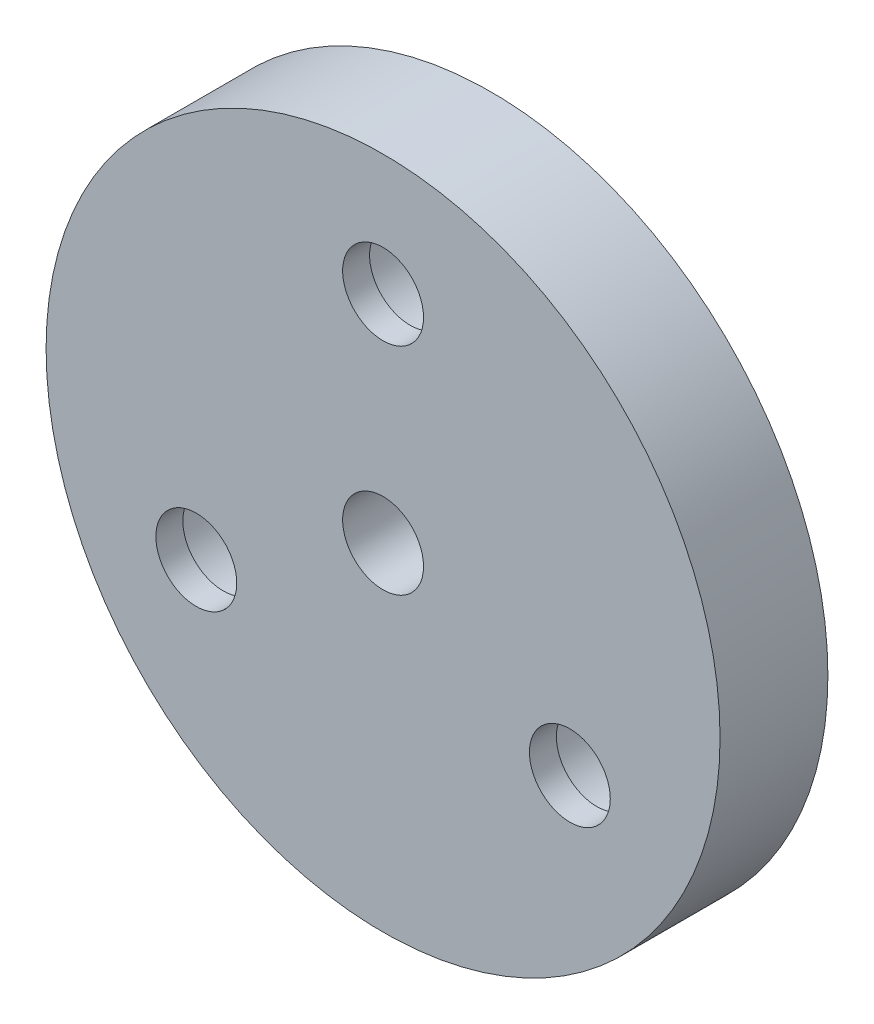
ISO-10303-21;
HEADER;
FILE_DESCRIPTION(('STEP AP214'),'2;1');
FILE_NAME('part.step','',(''),(''),'','','');
FILE_SCHEMA(('AUTOMOTIVE_DESIGN { 1 0 10303 214 1 1 1 1 }'));
ENDSEC;
DATA;
#1=APPLICATION_CONTEXT('core data for automotive mechanical design processes');
#2=APPLICATION_PROTOCOL_DEFINITION('international standard','automotive_design',2000,#1);
#3=PRODUCT_CONTEXT('',#1,'mechanical');
#4=PRODUCT('Part','Part','',(#3));
#5=PRODUCT_RELATED_PRODUCT_CATEGORY('part','',(#4));
#6=PRODUCT_DEFINITION_FORMATION('','',#4);
#7=PRODUCT_DEFINITION_CONTEXT('part definition',#1,'design');
#8=PRODUCT_DEFINITION('design','',#6,#7);
#9=PRODUCT_DEFINITION_SHAPE('','',#8);
#10=(LENGTH_UNIT() NAMED_UNIT(*) SI_UNIT(.MILLI.,.METRE.));
#11=(NAMED_UNIT(*) PLANE_ANGLE_UNIT() SI_UNIT($,.RADIAN.));
#12=(NAMED_UNIT(*) SI_UNIT($,.STERADIAN.) SOLID_ANGLE_UNIT());
#13=UNCERTAINTY_MEASURE_WITH_UNIT(LENGTH_MEASURE(1.E-05),#10,'distance_accuracy_value','');
#14=(GEOMETRIC_REPRESENTATION_CONTEXT(3) GLOBAL_UNCERTAINTY_ASSIGNED_CONTEXT((#13)) GLOBAL_UNIT_ASSIGNED_CONTEXT((#10,
#11,#12)) REPRESENTATION_CONTEXT('',''));
#15=CARTESIAN_POINT('',(0.,0.,0.));
#16=DIRECTION('',(0.,0.,1.));
#17=DIRECTION('',(1.,0.,0.));
#18=AXIS2_PLACEMENT_3D('',#15,#16,#17);
#19=CARTESIAN_POINT('',(-6.92820323027551,-4.,-4.));
#20=DIRECTION('',(0.,0.,1.));
#21=DIRECTION('',(-1.,0.,0.));
#22=AXIS2_PLACEMENT_3D('',#19,#20,#21);
#23=CYLINDRICAL_SURFACE('',#22,1.5);
#24=CARTESIAN_POINT('',(-6.92820323027551,-4.,0.));
#25=DIRECTION('',(0.,0.,1.));
#26=DIRECTION('',(1.,0.,0.));
#27=AXIS2_PLACEMENT_3D('',#24,#25,#26);
#28=CIRCLE('',#27,1.5);
#29=CARTESIAN_POINT('',(-5.42820323027551,-4.,0.));
#30=VERTEX_POINT('',#29);
#31=EDGE_CURVE('E50',#30,#30,#28,.T.);
#32=ORIENTED_EDGE('',*,*,#31,.T.);
#33=EDGE_LOOP('',(#32));
#34=FACE_BOUND('',#33,.T.);
#35=CARTESIAN_POINT('',(-6.92820323027551,-4.,-1.));
#36=DIRECTION('',(0.,0.,1.));
#37=DIRECTION('',(1.,0.,0.));
#38=AXIS2_PLACEMENT_3D('',#35,#36,#37);
#39=CIRCLE('',#38,1.5);
#40=CARTESIAN_POINT('',(-5.42820323027551,-4.,-1.));
#41=VERTEX_POINT('',#40);
#42=EDGE_CURVE('E41',#41,#41,#39,.T.);
#43=ORIENTED_EDGE('',*,*,#42,.F.);
#44=EDGE_LOOP('',(#43));
#45=FACE_BOUND('',#44,.T.);
#46=ADVANCED_FACE('F37',(#34,#45),#23,.F.);
#47=CARTESIAN_POINT('',(6.92820323027551,-4.,-4.));
#48=DIRECTION('',(0.,0.,1.));
#49=DIRECTION('',(-1.,0.,0.));
#50=AXIS2_PLACEMENT_3D('',#47,#48,#49);
#51=CYLINDRICAL_SURFACE('',#50,1.5);
#52=CARTESIAN_POINT('',(6.92820323027551,-4.,0.));
#53=DIRECTION('',(0.,0.,1.));
#54=DIRECTION('',(1.,0.,0.));
#55=AXIS2_PLACEMENT_3D('',#52,#53,#54);
#56=CIRCLE('',#55,1.5);
#57=CARTESIAN_POINT('',(8.42820323027551,-4.,0.));
#58=VERTEX_POINT('',#57);
#59=EDGE_CURVE('E67',#58,#58,#56,.T.);
#60=ORIENTED_EDGE('',*,*,#59,.T.);
#61=EDGE_LOOP('',(#60));
#62=FACE_BOUND('',#61,.T.);
#63=CARTESIAN_POINT('',(6.92820323027551,-4.,-1.));
#64=DIRECTION('',(0.,0.,1.));
#65=DIRECTION('',(1.,0.,0.));
#66=AXIS2_PLACEMENT_3D('',#63,#64,#65);
#67=CIRCLE('',#66,1.5);
#68=CARTESIAN_POINT('',(8.42820323027551,-4.,-1.));
#69=VERTEX_POINT('',#68);
#70=EDGE_CURVE('E57',#69,#69,#67,.T.);
#71=ORIENTED_EDGE('',*,*,#70,.F.);
#72=EDGE_LOOP('',(#71));
#73=FACE_BOUND('',#72,.T.);
#74=ADVANCED_FACE('F112',(#62,#73),#51,.F.);
#75=CARTESIAN_POINT('',(0.,8.,-4.));
#76=DIRECTION('',(0.,0.,1.));
#77=DIRECTION('',(-1.,0.,0.));
#78=AXIS2_PLACEMENT_3D('',#75,#76,#77);
#79=CYLINDRICAL_SURFACE('',#78,1.5);
#80=CARTESIAN_POINT('',(0.,8.,0.));
#81=DIRECTION('',(0.,0.,1.));
#82=DIRECTION('',(1.,0.,0.));
#83=AXIS2_PLACEMENT_3D('',#80,#81,#82);
#84=CIRCLE('',#83,1.5);
#85=CARTESIAN_POINT('',(1.5,8.,0.));
#86=VERTEX_POINT('',#85);
#87=EDGE_CURVE('E63',#86,#86,#84,.T.);
#88=ORIENTED_EDGE('',*,*,#87,.T.);
#89=EDGE_LOOP('',(#88));
#90=FACE_BOUND('',#89,.T.);
#91=CARTESIAN_POINT('',(0.,8.,-1.));
#92=DIRECTION('',(0.,0.,1.));
#93=DIRECTION('',(1.,0.,0.));
#94=AXIS2_PLACEMENT_3D('',#91,#92,#93);
#95=CIRCLE('',#94,1.5);
#96=CARTESIAN_POINT('',(1.5,8.,-1.));
#97=VERTEX_POINT('',#96);
#98=EDGE_CURVE('E55',#97,#97,#95,.T.);
#99=ORIENTED_EDGE('',*,*,#98,.F.);
#100=EDGE_LOOP('',(#99));
#101=FACE_BOUND('',#100,.T.);
#102=ADVANCED_FACE('F103',(#90,#101),#79,.F.);
#103=CARTESIAN_POINT('',(0.,0.,0.));
#104=DIRECTION('',(0.,0.,-1.));
#105=DIRECTION('',(1.,0.,0.));
#106=AXIS2_PLACEMENT_3D('',#103,#104,#105);
#107=PLANE('',#106);
#108=CARTESIAN_POINT('',(0.,0.,0.));
#109=DIRECTION('',(0.,0.,1.));
#110=DIRECTION('',(1.,0.,0.));
#111=AXIS2_PLACEMENT_3D('',#108,#109,#110);
#112=CIRCLE('',#111,1.5);
#113=CARTESIAN_POINT('',(1.5,0.,0.));
#114=VERTEX_POINT('',#113);
#115=EDGE_CURVE('E80',#114,#114,#112,.T.);
#116=ORIENTED_EDGE('',*,*,#115,.F.);
#117=EDGE_LOOP('',(#116));
#118=FACE_BOUND('',#117,.T.);
#119=CARTESIAN_POINT('',(0.,0.,0.));
#120=DIRECTION('',(0.,0.,1.));
#121=DIRECTION('',(1.,0.,0.));
#122=AXIS2_PLACEMENT_3D('',#119,#120,#121);
#123=CIRCLE('',#122,12.5);
#124=CARTESIAN_POINT('',(12.5,0.,0.));
#125=VERTEX_POINT('',#124);
#126=EDGE_CURVE('E45',#125,#125,#123,.T.);
#127=ORIENTED_EDGE('',*,*,#126,.T.);
#128=EDGE_LOOP('',(#127));
#129=FACE_BOUND('',#128,.T.);
#130=ORIENTED_EDGE('',*,*,#31,.F.);
#131=EDGE_LOOP('',(#130));
#132=FACE_BOUND('',#131,.T.);
#133=ORIENTED_EDGE('',*,*,#59,.F.);
#134=EDGE_LOOP('',(#133));
#135=FACE_BOUND('',#134,.T.);
#136=ORIENTED_EDGE('',*,*,#87,.F.);
#137=EDGE_LOOP('',(#136));
#138=FACE_BOUND('',#137,.T.);
#139=ADVANCED_FACE('F39',(#118,#129,#132,#135,#138),#107,.F.);
#140=CARTESIAN_POINT('',(0.,0.,-4.));
#141=DIRECTION('',(0.,0.,1.));
#142=DIRECTION('',(-1.,0.,0.));
#143=AXIS2_PLACEMENT_3D('',#140,#141,#142);
#144=CYLINDRICAL_SURFACE('',#143,12.5);
#145=CARTESIAN_POINT('',(0.,0.,-4.));
#146=DIRECTION('',(0.,0.,1.));
#147=DIRECTION('',(1.,0.,0.));
#148=AXIS2_PLACEMENT_3D('',#145,#146,#147);
#149=CIRCLE('',#148,12.5);
#150=CARTESIAN_POINT('',(12.5,0.,-4.));
#151=VERTEX_POINT('',#150);
#152=EDGE_CURVE('E11',#151,#151,#149,.T.);
#153=ORIENTED_EDGE('',*,*,#152,.T.);
#154=EDGE_LOOP('',(#153));
#155=FACE_BOUND('',#154,.T.);
#156=ORIENTED_EDGE('',*,*,#126,.F.);
#157=EDGE_LOOP('',(#156));
#158=FACE_BOUND('',#157,.T.);
#159=ADVANCED_FACE('F102',(#155,#158),#144,.T.);
#160=CARTESIAN_POINT('',(0.,0.,-4.));
#161=DIRECTION('',(0.,0.,-1.));
#162=DIRECTION('',(1.,0.,0.));
#163=AXIS2_PLACEMENT_3D('',#160,#161,#162);
#164=PLANE('',#163);
#165=CARTESIAN_POINT('',(0.,0.,-4.));
#166=DIRECTION('',(0.,0.,1.));
#167=DIRECTION('',(1.,0.,0.));
#168=AXIS2_PLACEMENT_3D('',#165,#166,#167);
#169=CIRCLE('',#168,1.5);
#170=CARTESIAN_POINT('',(1.5,0.,-4.));
#171=VERTEX_POINT('',#170);
#172=EDGE_CURVE('E91',#171,#171,#169,.T.);
#173=ORIENTED_EDGE('',*,*,#172,.T.);
#174=EDGE_LOOP('',(#173));
#175=FACE_BOUND('',#174,.T.);
#176=CARTESIAN_POINT('',(0.,8.,-4.));
#177=DIRECTION('',(0.,0.,1.));
#178=DIRECTION('',(1.,0.,0.));
#179=AXIS2_PLACEMENT_3D('',#176,#177,#178);
#180=CIRCLE('',#179,2.25);
#181=CARTESIAN_POINT('',(2.25,8.,-4.));
#182=VERTEX_POINT('',#181);
#183=EDGE_CURVE('E84',#182,#182,#180,.T.);
#184=ORIENTED_EDGE('',*,*,#183,.T.);
#185=EDGE_LOOP('',(#184));
#186=FACE_BOUND('',#185,.T.);
#187=CARTESIAN_POINT('',(6.92820323027551,-4.,-4.));
#188=DIRECTION('',(0.,0.,1.));
#189=DIRECTION('',(1.,0.,0.));
#190=AXIS2_PLACEMENT_3D('',#187,#188,#189);
#191=CIRCLE('',#190,2.25);
#192=CARTESIAN_POINT('',(9.17820323027551,-4.,-4.));
#193=VERTEX_POINT('',#192);
#194=EDGE_CURVE('E81',#193,#193,#191,.T.);
#195=ORIENTED_EDGE('',*,*,#194,.T.);
#196=EDGE_LOOP('',(#195));
#197=FACE_BOUND('',#196,.T.);
#198=CARTESIAN_POINT('',(-6.92820323027551,-4.,-4.));
#199=DIRECTION('',(0.,0.,1.));
#200=DIRECTION('',(1.,0.,0.));
#201=AXIS2_PLACEMENT_3D('',#198,#199,#200);
#202=CIRCLE('',#201,2.25);
#203=CARTESIAN_POINT('',(-4.67820323027551,-4.,-4.));
#204=VERTEX_POINT('',#203);
#205=EDGE_CURVE('E73',#204,#204,#202,.T.);
#206=ORIENTED_EDGE('',*,*,#205,.T.);
#207=EDGE_LOOP('',(#206));
#208=FACE_BOUND('',#207,.T.);
#209=ORIENTED_EDGE('',*,*,#152,.F.);
#210=EDGE_LOOP('',(#209));
#211=FACE_BOUND('',#210,.T.);
#212=ADVANCED_FACE('F126',(#175,#186,#197,#208,#211),#164,.T.);
#213=CARTESIAN_POINT('',(-6.92820323027551,-4.,6.36396103067893));
#214=DIRECTION('',(0.,0.,-1.));
#215=DIRECTION('',(1.,0.,0.));
#216=AXIS2_PLACEMENT_3D('',#213,#214,#215);
#217=CYLINDRICAL_SURFACE('',#216,2.25);
#218=CARTESIAN_POINT('',(-6.92820323027551,-4.,-1.));
#219=DIRECTION('',(0.,0.,1.));
#220=DIRECTION('',(1.,0.,0.));
#221=AXIS2_PLACEMENT_3D('',#218,#219,#220);
#222=CIRCLE('',#221,2.25);
#223=CARTESIAN_POINT('',(-4.67820323027551,-4.,-1.));
#224=VERTEX_POINT('',#223);
#225=EDGE_CURVE('E77',#224,#224,#222,.F.);
#226=CARTESIAN_POINT('',(-4.67820323027551,-4.,-1.));
#227=CARTESIAN_POINT('',(-4.67820323027551,-4.,-1.03125));
#228=CARTESIAN_POINT('',(-4.67820323027551,-4.,-1.0625));
#229=CARTESIAN_POINT('',(-4.67820323027551,-4.,-1.125));
#230=CARTESIAN_POINT('',(-4.67820323027551,-4.,-1.15625));
#231=CARTESIAN_POINT('',(-4.67820323027551,-4.,-1.21875));
#232=CARTESIAN_POINT('',(-4.67820323027551,-4.,-1.25));
#233=CARTESIAN_POINT('',(-4.67820323027551,-4.,-1.3125));
#234=CARTESIAN_POINT('',(-4.67820323027551,-4.,-1.34375));
#235=CARTESIAN_POINT('',(-4.67820323027551,-4.,-1.40625));
#236=CARTESIAN_POINT('',(-4.67820323027551,-4.,-1.4375));
#237=CARTESIAN_POINT('',(-4.67820323027551,-4.,-1.5));
#238=CARTESIAN_POINT('',(-4.67820323027551,-4.,-1.53125));
#239=CARTESIAN_POINT('',(-4.67820323027551,-4.,-1.59375));
#240=CARTESIAN_POINT('',(-4.67820323027551,-4.,-1.625));
#241=CARTESIAN_POINT('',(-4.67820323027551,-4.,-1.6875));
#242=CARTESIAN_POINT('',(-4.67820323027551,-4.,-1.71875));
#243=CARTESIAN_POINT('',(-4.67820323027551,-4.,-1.78125));
#244=CARTESIAN_POINT('',(-4.67820323027551,-4.,-1.8125));
#245=CARTESIAN_POINT('',(-4.67820323027551,-4.,-1.875));
#246=CARTESIAN_POINT('',(-4.67820323027551,-4.,-1.90625));
#247=CARTESIAN_POINT('',(-4.67820323027551,-4.,-1.96875));
#248=CARTESIAN_POINT('',(-4.67820323027551,-4.,-2.));
#249=CARTESIAN_POINT('',(-4.67820323027551,-4.,-2.0625));
#250=CARTESIAN_POINT('',(-4.67820323027551,-4.,-2.09375));
#251=CARTESIAN_POINT('',(-4.67820323027551,-4.,-2.15625));
#252=CARTESIAN_POINT('',(-4.67820323027551,-4.,-2.1875));
#253=CARTESIAN_POINT('',(-4.67820323027551,-4.,-2.25));
#254=CARTESIAN_POINT('',(-4.67820323027551,-4.,-2.28125));
#255=CARTESIAN_POINT('',(-4.67820323027551,-4.,-2.34375));
#256=CARTESIAN_POINT('',(-4.67820323027551,-4.,-2.375));
#257=CARTESIAN_POINT('',(-4.67820323027551,-4.,-2.4375));
#258=CARTESIAN_POINT('',(-4.67820323027551,-4.,-2.46875));
#259=CARTESIAN_POINT('',(-4.67820323027551,-4.,-2.53125));
#260=CARTESIAN_POINT('',(-4.67820323027551,-4.,-2.5625));
#261=CARTESIAN_POINT('',(-4.67820323027551,-4.,-2.625));
#262=CARTESIAN_POINT('',(-4.67820323027551,-4.,-2.65625));
#263=CARTESIAN_POINT('',(-4.67820323027551,-4.,-2.71875));
#264=CARTESIAN_POINT('',(-4.67820323027551,-4.,-2.75));
#265=CARTESIAN_POINT('',(-4.67820323027551,-4.,-2.8125));
#266=CARTESIAN_POINT('',(-4.67820323027551,-4.,-2.84375));
#267=CARTESIAN_POINT('',(-4.67820323027551,-4.,-2.90625));
#268=CARTESIAN_POINT('',(-4.67820323027551,-4.,-2.9375));
#269=CARTESIAN_POINT('',(-4.67820323027551,-4.,-3.));
#270=CARTESIAN_POINT('',(-4.67820323027551,-4.,-3.03125));
#271=CARTESIAN_POINT('',(-4.67820323027551,-4.,-3.09375));
#272=CARTESIAN_POINT('',(-4.67820323027551,-4.,-3.125));
#273=CARTESIAN_POINT('',(-4.67820323027551,-4.,-3.1875));
#274=CARTESIAN_POINT('',(-4.67820323027551,-4.,-3.21875));
#275=CARTESIAN_POINT('',(-4.67820323027551,-4.,-3.28125));
#276=CARTESIAN_POINT('',(-4.67820323027551,-4.,-3.3125));
#277=CARTESIAN_POINT('',(-4.67820323027551,-4.,-3.375));
#278=CARTESIAN_POINT('',(-4.67820323027551,-4.,-3.40625));
#279=CARTESIAN_POINT('',(-4.67820323027551,-4.,-3.46875));
#280=CARTESIAN_POINT('',(-4.67820323027551,-4.,-3.5));
#281=CARTESIAN_POINT('',(-4.67820323027551,-4.,-3.5625));
#282=CARTESIAN_POINT('',(-4.67820323027551,-4.,-3.59375));
#283=CARTESIAN_POINT('',(-4.67820323027551,-4.,-3.65625));
#284=CARTESIAN_POINT('',(-4.67820323027551,-4.,-3.6875));
#285=CARTESIAN_POINT('',(-4.67820323027551,-4.,-3.75));
#286=CARTESIAN_POINT('',(-4.67820323027551,-4.,-3.78125));
#287=CARTESIAN_POINT('',(-4.67820323027551,-4.,-3.84375));
#288=CARTESIAN_POINT('',(-4.67820323027551,-4.,-3.875));
#289=CARTESIAN_POINT('',(-4.67820323027551,-4.,-3.9375));
#290=CARTESIAN_POINT('',(-4.67820323027551,-4.,-3.96875));
#291=CARTESIAN_POINT('',(-4.67820323027551,-4.,-4.));
#292=B_SPLINE_CURVE_WITH_KNOTS('',3,(#226,#227,#228,#229,#230,#231,#232,#233,#234,#235,#236,
#237,#238,#239,#240,#241,#242,#243,#244,#245,#246,#247,#248,#249,#250,#251,#252,#253,#254,#255,
#256,#257,#258,#259,#260,#261,#262,#263,#264,#265,#266,#267,#268,#269,#270,#271,#272,#273,#274,
#275,#276,#277,#278,#279,#280,#281,#282,#283,#284,#285,#286,#287,#288,#289,#290,#291),
.UNSPECIFIED.,.F.,.F.,(4,2,2,2,2,2,2,2,2,2,2,2,2,2,2,2,2,2,2,2,2,2,2,2,2,2,2,2,2,2,2,2,4),(0.,
0.0937500000000001,0.1875,0.28125,0.375,0.46875,0.5625,0.65625,0.75,0.84375,0.9375,1.03125,
1.125,1.21875,1.3125,1.40625,1.5,1.59375,1.6875,1.78125,1.875,1.96875,2.0625,2.15625,2.25,
2.34375,2.4375,2.53125,2.625,2.71875,2.8125,2.90625,3.),.UNSPECIFIED.);
#293=EDGE_CURVE('BSEAM128',#224,#204,#292,.T.);
#294=ORIENTED_EDGE('',*,*,#225,.F.);
#295=ORIENTED_EDGE('',*,*,#205,.F.);
#296=ORIENTED_EDGE('',*,*,#293,.T.);
#297=ORIENTED_EDGE('',*,*,#293,.F.);
#298=EDGE_LOOP('',(#294,#296,#295,#297));
#299=FACE_BOUND('',#298,.T.);
#300=ADVANCED_FACE('F128',(#299),#217,.F.);
#301=CARTESIAN_POINT('',(0.,0.,-1.));
#302=DIRECTION('',(0.,0.,-1.));
#303=DIRECTION('',(1.,0.,0.));
#304=AXIS2_PLACEMENT_3D('',#301,#302,#303);
#305=PLANE('',#304);
#306=ORIENTED_EDGE('',*,*,#42,.T.);
#307=EDGE_LOOP('',(#306));
#308=FACE_BOUND('',#307,.T.);
#309=ORIENTED_EDGE('',*,*,#225,.T.);
#310=EDGE_LOOP('',(#309));
#311=FACE_BOUND('',#310,.T.);
#312=ADVANCED_FACE('F133',(#308,#311),#305,.T.);
#313=CARTESIAN_POINT('',(6.92820323027551,-4.,6.36396103067893));
#314=DIRECTION('',(0.,0.,-1.));
#315=DIRECTION('',(1.,0.,0.));
#316=AXIS2_PLACEMENT_3D('',#313,#314,#315);
#317=CYLINDRICAL_SURFACE('',#316,2.25);
#318=CARTESIAN_POINT('',(6.92820323027551,-4.,-1.));
#319=DIRECTION('',(0.,0.,1.));
#320=DIRECTION('',(1.,0.,0.));
#321=AXIS2_PLACEMENT_3D('',#318,#319,#320);
#322=CIRCLE('',#321,2.25);
#323=CARTESIAN_POINT('',(9.17820323027551,-4.,-1.));
#324=VERTEX_POINT('',#323);
#325=EDGE_CURVE('E76',#324,#324,#322,.F.);
#326=CARTESIAN_POINT('',(9.17820323027551,-4.,-1.));
#327=CARTESIAN_POINT('',(9.17820323027551,-4.,-1.03125));
#328=CARTESIAN_POINT('',(9.17820323027551,-4.,-1.0625));
#329=CARTESIAN_POINT('',(9.17820323027551,-4.,-1.125));
#330=CARTESIAN_POINT('',(9.17820323027551,-4.,-1.15625));
#331=CARTESIAN_POINT('',(9.17820323027551,-4.,-1.21875));
#332=CARTESIAN_POINT('',(9.17820323027551,-4.,-1.25));
#333=CARTESIAN_POINT('',(9.17820323027551,-4.,-1.3125));
#334=CARTESIAN_POINT('',(9.17820323027551,-4.,-1.34375));
#335=CARTESIAN_POINT('',(9.17820323027551,-4.,-1.40625));
#336=CARTESIAN_POINT('',(9.17820323027551,-4.,-1.4375));
#337=CARTESIAN_POINT('',(9.17820323027551,-4.,-1.5));
#338=CARTESIAN_POINT('',(9.17820323027551,-4.,-1.53125));
#339=CARTESIAN_POINT('',(9.17820323027551,-4.,-1.59375));
#340=CARTESIAN_POINT('',(9.17820323027551,-4.,-1.625));
#341=CARTESIAN_POINT('',(9.17820323027551,-4.,-1.6875));
#342=CARTESIAN_POINT('',(9.17820323027551,-4.,-1.71875));
#343=CARTESIAN_POINT('',(9.17820323027551,-4.,-1.78125));
#344=CARTESIAN_POINT('',(9.17820323027551,-4.,-1.8125));
#345=CARTESIAN_POINT('',(9.17820323027551,-4.,-1.875));
#346=CARTESIAN_POINT('',(9.17820323027551,-4.,-1.90625));
#347=CARTESIAN_POINT('',(9.17820323027551,-4.,-1.96875));
#348=CARTESIAN_POINT('',(9.17820323027551,-4.,-2.));
#349=CARTESIAN_POINT('',(9.17820323027551,-4.,-2.0625));
#350=CARTESIAN_POINT('',(9.17820323027551,-4.,-2.09375));
#351=CARTESIAN_POINT('',(9.17820323027551,-4.,-2.15625));
#352=CARTESIAN_POINT('',(9.17820323027551,-4.,-2.1875));
#353=CARTESIAN_POINT('',(9.17820323027551,-4.,-2.25));
#354=CARTESIAN_POINT('',(9.17820323027551,-4.,-2.28125));
#355=CARTESIAN_POINT('',(9.17820323027551,-4.,-2.34375));
#356=CARTESIAN_POINT('',(9.17820323027551,-4.,-2.375));
#357=CARTESIAN_POINT('',(9.17820323027551,-4.,-2.4375));
#358=CARTESIAN_POINT('',(9.17820323027551,-4.,-2.46875));
#359=CARTESIAN_POINT('',(9.17820323027551,-4.,-2.53125));
#360=CARTESIAN_POINT('',(9.17820323027551,-4.,-2.5625));
#361=CARTESIAN_POINT('',(9.17820323027551,-4.,-2.625));
#362=CARTESIAN_POINT('',(9.17820323027551,-4.,-2.65625));
#363=CARTESIAN_POINT('',(9.17820323027551,-4.,-2.71875));
#364=CARTESIAN_POINT('',(9.17820323027551,-4.,-2.75));
#365=CARTESIAN_POINT('',(9.17820323027551,-4.,-2.8125));
#366=CARTESIAN_POINT('',(9.17820323027551,-4.,-2.84375));
#367=CARTESIAN_POINT('',(9.17820323027551,-4.,-2.90625));
#368=CARTESIAN_POINT('',(9.17820323027551,-4.,-2.9375));
#369=CARTESIAN_POINT('',(9.17820323027551,-4.,-3.));
#370=CARTESIAN_POINT('',(9.17820323027551,-4.,-3.03125));
#371=CARTESIAN_POINT('',(9.17820323027551,-4.,-3.09375));
#372=CARTESIAN_POINT('',(9.17820323027551,-4.,-3.125));
#373=CARTESIAN_POINT('',(9.17820323027551,-4.,-3.1875));
#374=CARTESIAN_POINT('',(9.17820323027551,-4.,-3.21875));
#375=CARTESIAN_POINT('',(9.17820323027551,-4.,-3.28125));
#376=CARTESIAN_POINT('',(9.17820323027551,-4.,-3.3125));
#377=CARTESIAN_POINT('',(9.17820323027551,-4.,-3.375));
#378=CARTESIAN_POINT('',(9.17820323027551,-4.,-3.40625));
#379=CARTESIAN_POINT('',(9.17820323027551,-4.,-3.46875));
#380=CARTESIAN_POINT('',(9.17820323027551,-4.,-3.5));
#381=CARTESIAN_POINT('',(9.17820323027551,-4.,-3.5625));
#382=CARTESIAN_POINT('',(9.17820323027551,-4.,-3.59375));
#383=CARTESIAN_POINT('',(9.17820323027551,-4.,-3.65625));
#384=CARTESIAN_POINT('',(9.17820323027551,-4.,-3.6875));
#385=CARTESIAN_POINT('',(9.17820323027551,-4.,-3.75));
#386=CARTESIAN_POINT('',(9.17820323027551,-4.,-3.78125));
#387=CARTESIAN_POINT('',(9.17820323027551,-4.,-3.84375));
#388=CARTESIAN_POINT('',(9.17820323027551,-4.,-3.875));
#389=CARTESIAN_POINT('',(9.17820323027551,-4.,-3.9375));
#390=CARTESIAN_POINT('',(9.17820323027551,-4.,-3.96875));
#391=CARTESIAN_POINT('',(9.17820323027551,-4.,-4.));
#392=B_SPLINE_CURVE_WITH_KNOTS('',3,(#326,#327,#328,#329,#330,#331,#332,#333,#334,#335,#336,
#337,#338,#339,#340,#341,#342,#343,#344,#345,#346,#347,#348,#349,#350,#351,#352,#353,#354,#355,
#356,#357,#358,#359,#360,#361,#362,#363,#364,#365,#366,#367,#368,#369,#370,#371,#372,#373,#374,
#375,#376,#377,#378,#379,#380,#381,#382,#383,#384,#385,#386,#387,#388,#389,#390,#391),
.UNSPECIFIED.,.F.,.F.,(4,2,2,2,2,2,2,2,2,2,2,2,2,2,2,2,2,2,2,2,2,2,2,2,2,2,2,2,2,2,2,2,4),(0.,
0.0937500000000001,0.1875,0.28125,0.375,0.46875,0.5625,0.65625,0.75,0.84375,0.9375,1.03125,
1.125,1.21875,1.3125,1.40625,1.5,1.59375,1.6875,1.78125,1.875,1.96875,2.0625,2.15625,2.25,
2.34375,2.4375,2.53125,2.625,2.71875,2.8125,2.90625,3.),.UNSPECIFIED.);
#393=EDGE_CURVE('BSEAM146',#324,#193,#392,.T.);
#394=ORIENTED_EDGE('',*,*,#325,.F.);
#395=ORIENTED_EDGE('',*,*,#194,.F.);
#396=ORIENTED_EDGE('',*,*,#393,.T.);
#397=ORIENTED_EDGE('',*,*,#393,.F.);
#398=EDGE_LOOP('',(#394,#396,#395,#397));
#399=FACE_BOUND('',#398,.T.);
#400=ADVANCED_FACE('F146',(#399),#317,.F.);
#401=CARTESIAN_POINT('',(0.,0.,-1.));
#402=DIRECTION('',(0.,0.,-1.));
#403=DIRECTION('',(1.,0.,0.));
#404=AXIS2_PLACEMENT_3D('',#401,#402,#403);
#405=PLANE('',#404);
#406=ORIENTED_EDGE('',*,*,#70,.T.);
#407=EDGE_LOOP('',(#406));
#408=FACE_BOUND('',#407,.T.);
#409=ORIENTED_EDGE('',*,*,#325,.T.);
#410=EDGE_LOOP('',(#409));
#411=FACE_BOUND('',#410,.T.);
#412=ADVANCED_FACE('F148',(#408,#411),#405,.T.);
#413=CARTESIAN_POINT('',(0.,8.,6.36396103067893));
#414=DIRECTION('',(0.,0.,-1.));
#415=DIRECTION('',(1.,0.,0.));
#416=AXIS2_PLACEMENT_3D('',#413,#414,#415);
#417=CYLINDRICAL_SURFACE('',#416,2.25);
#418=CARTESIAN_POINT('',(0.,8.,-1.));
#419=DIRECTION('',(0.,0.,1.));
#420=DIRECTION('',(1.,0.,0.));
#421=AXIS2_PLACEMENT_3D('',#418,#419,#420);
#422=CIRCLE('',#421,2.25);
#423=CARTESIAN_POINT('',(2.25,8.,-1.));
#424=VERTEX_POINT('',#423);
#425=EDGE_CURVE('E58',#424,#424,#422,.F.);
#426=CARTESIAN_POINT('',(2.25,8.,-1.));
#427=CARTESIAN_POINT('',(2.25,8.,-1.03125));
#428=CARTESIAN_POINT('',(2.25,8.,-1.0625));
#429=CARTESIAN_POINT('',(2.25,8.,-1.125));
#430=CARTESIAN_POINT('',(2.25,8.,-1.15625));
#431=CARTESIAN_POINT('',(2.25,8.,-1.21875));
#432=CARTESIAN_POINT('',(2.25,8.,-1.25));
#433=CARTESIAN_POINT('',(2.25,8.,-1.3125));
#434=CARTESIAN_POINT('',(2.25,8.,-1.34375));
#435=CARTESIAN_POINT('',(2.25,8.,-1.40625));
#436=CARTESIAN_POINT('',(2.25,8.,-1.4375));
#437=CARTESIAN_POINT('',(2.25,8.,-1.5));
#438=CARTESIAN_POINT('',(2.25,8.,-1.53125));
#439=CARTESIAN_POINT('',(2.25,8.,-1.59375));
#440=CARTESIAN_POINT('',(2.25,8.,-1.625));
#441=CARTESIAN_POINT('',(2.25,8.,-1.6875));
#442=CARTESIAN_POINT('',(2.25,8.,-1.71875));
#443=CARTESIAN_POINT('',(2.25,8.,-1.78125));
#444=CARTESIAN_POINT('',(2.25,8.,-1.8125));
#445=CARTESIAN_POINT('',(2.25,8.,-1.875));
#446=CARTESIAN_POINT('',(2.25,8.,-1.90625));
#447=CARTESIAN_POINT('',(2.25,8.,-1.96875));
#448=CARTESIAN_POINT('',(2.25,8.,-2.));
#449=CARTESIAN_POINT('',(2.25,8.,-2.0625));
#450=CARTESIAN_POINT('',(2.25,8.,-2.09375));
#451=CARTESIAN_POINT('',(2.25,8.,-2.15625));
#452=CARTESIAN_POINT('',(2.25,8.,-2.1875));
#453=CARTESIAN_POINT('',(2.25,8.,-2.25));
#454=CARTESIAN_POINT('',(2.25,8.,-2.28125));
#455=CARTESIAN_POINT('',(2.25,8.,-2.34375));
#456=CARTESIAN_POINT('',(2.25,8.,-2.375));
#457=CARTESIAN_POINT('',(2.25,8.,-2.4375));
#458=CARTESIAN_POINT('',(2.25,8.,-2.46875));
#459=CARTESIAN_POINT('',(2.25,8.,-2.53125));
#460=CARTESIAN_POINT('',(2.25,8.,-2.5625));
#461=CARTESIAN_POINT('',(2.25,8.,-2.625));
#462=CARTESIAN_POINT('',(2.25,8.,-2.65625));
#463=CARTESIAN_POINT('',(2.25,8.,-2.71875));
#464=CARTESIAN_POINT('',(2.25,8.,-2.75));
#465=CARTESIAN_POINT('',(2.25,8.,-2.8125));
#466=CARTESIAN_POINT('',(2.25,8.,-2.84375));
#467=CARTESIAN_POINT('',(2.25,8.,-2.90625));
#468=CARTESIAN_POINT('',(2.25,8.,-2.9375));
#469=CARTESIAN_POINT('',(2.25,8.,-3.));
#470=CARTESIAN_POINT('',(2.25,8.,-3.03125));
#471=CARTESIAN_POINT('',(2.25,8.,-3.09375));
#472=CARTESIAN_POINT('',(2.25,8.,-3.125));
#473=CARTESIAN_POINT('',(2.25,8.,-3.1875));
#474=CARTESIAN_POINT('',(2.25,8.,-3.21875));
#475=CARTESIAN_POINT('',(2.25,8.,-3.28125));
#476=CARTESIAN_POINT('',(2.25,8.,-3.3125));
#477=CARTESIAN_POINT('',(2.25,8.,-3.375));
#478=CARTESIAN_POINT('',(2.25,8.,-3.40625));
#479=CARTESIAN_POINT('',(2.25,8.,-3.46875));
#480=CARTESIAN_POINT('',(2.25,8.,-3.5));
#481=CARTESIAN_POINT('',(2.25,8.,-3.5625));
#482=CARTESIAN_POINT('',(2.25,8.,-3.59375));
#483=CARTESIAN_POINT('',(2.25,8.,-3.65625));
#484=CARTESIAN_POINT('',(2.25,8.,-3.6875));
#485=CARTESIAN_POINT('',(2.25,8.,-3.75));
#486=CARTESIAN_POINT('',(2.25,8.,-3.78125));
#487=CARTESIAN_POINT('',(2.25,8.,-3.84375));
#488=CARTESIAN_POINT('',(2.25,8.,-3.875));
#489=CARTESIAN_POINT('',(2.25,8.,-3.9375));
#490=CARTESIAN_POINT('',(2.25,8.,-3.96875));
#491=CARTESIAN_POINT('',(2.25,8.,-4.));
#492=B_SPLINE_CURVE_WITH_KNOTS('',3,(#426,#427,#428,#429,#430,#431,#432,#433,#434,#435,#436,
#437,#438,#439,#440,#441,#442,#443,#444,#445,#446,#447,#448,#449,#450,#451,#452,#453,#454,#455,
#456,#457,#458,#459,#460,#461,#462,#463,#464,#465,#466,#467,#468,#469,#470,#471,#472,#473,#474,
#475,#476,#477,#478,#479,#480,#481,#482,#483,#484,#485,#486,#487,#488,#489,#490,#491),
.UNSPECIFIED.,.F.,.F.,(4,2,2,2,2,2,2,2,2,2,2,2,2,2,2,2,2,2,2,2,2,2,2,2,2,2,2,2,2,2,2,2,4),(0.,
0.0937500000000001,0.1875,0.28125,0.375,0.46875,0.5625,0.65625,0.75,0.84375,0.9375,1.03125,
1.125,1.21875,1.3125,1.40625,1.5,1.59375,1.6875,1.78125,1.875,1.96875,2.0625,2.15625,2.25,
2.34375,2.4375,2.53125,2.625,2.71875,2.8125,2.90625,3.),.UNSPECIFIED.);
#493=EDGE_CURVE('BSEAM155',#424,#182,#492,.T.);
#494=ORIENTED_EDGE('',*,*,#425,.F.);
#495=ORIENTED_EDGE('',*,*,#183,.F.);
#496=ORIENTED_EDGE('',*,*,#493,.T.);
#497=ORIENTED_EDGE('',*,*,#493,.F.);
#498=EDGE_LOOP('',(#494,#496,#495,#497));
#499=FACE_BOUND('',#498,.T.);
#500=ADVANCED_FACE('F155',(#499),#417,.F.);
#501=CARTESIAN_POINT('',(0.,0.,-1.));
#502=DIRECTION('',(0.,0.,-1.));
#503=DIRECTION('',(1.,0.,0.));
#504=AXIS2_PLACEMENT_3D('',#501,#502,#503);
#505=PLANE('',#504);
#506=ORIENTED_EDGE('',*,*,#98,.T.);
#507=EDGE_LOOP('',(#506));
#508=FACE_BOUND('',#507,.T.);
#509=ORIENTED_EDGE('',*,*,#425,.T.);
#510=EDGE_LOOP('',(#509));
#511=FACE_BOUND('',#510,.T.);
#512=ADVANCED_FACE('F161',(#508,#511),#505,.T.);
#513=CARTESIAN_POINT('',(0.,0.,0.));
#514=DIRECTION('',(0.,0.,-1.));
#515=DIRECTION('',(1.,0.,0.));
#516=AXIS2_PLACEMENT_3D('',#513,#514,#515);
#517=CYLINDRICAL_SURFACE('',#516,1.5);
#518=ORIENTED_EDGE('',*,*,#115,.T.);
#519=EDGE_LOOP('',(#518));
#520=FACE_BOUND('',#519,.T.);
#521=ORIENTED_EDGE('',*,*,#172,.F.);
#522=EDGE_LOOP('',(#521));
#523=FACE_BOUND('',#522,.T.);
#524=ADVANCED_FACE('F97',(#520,#523),#517,.F.);
#525=CLOSED_SHELL('',(#46,#74,#102,#139,#159,#212,#300,#312,#400,#412,#500,#512,#524));
#526=MANIFOLD_SOLID_BREP('B2',#525);
#527=ADVANCED_BREP_SHAPE_REPRESENTATION('',(#18,#526),#14);
#528=SHAPE_DEFINITION_REPRESENTATION(#9,#527);
ENDSEC;
END-ISO-10303-21;
